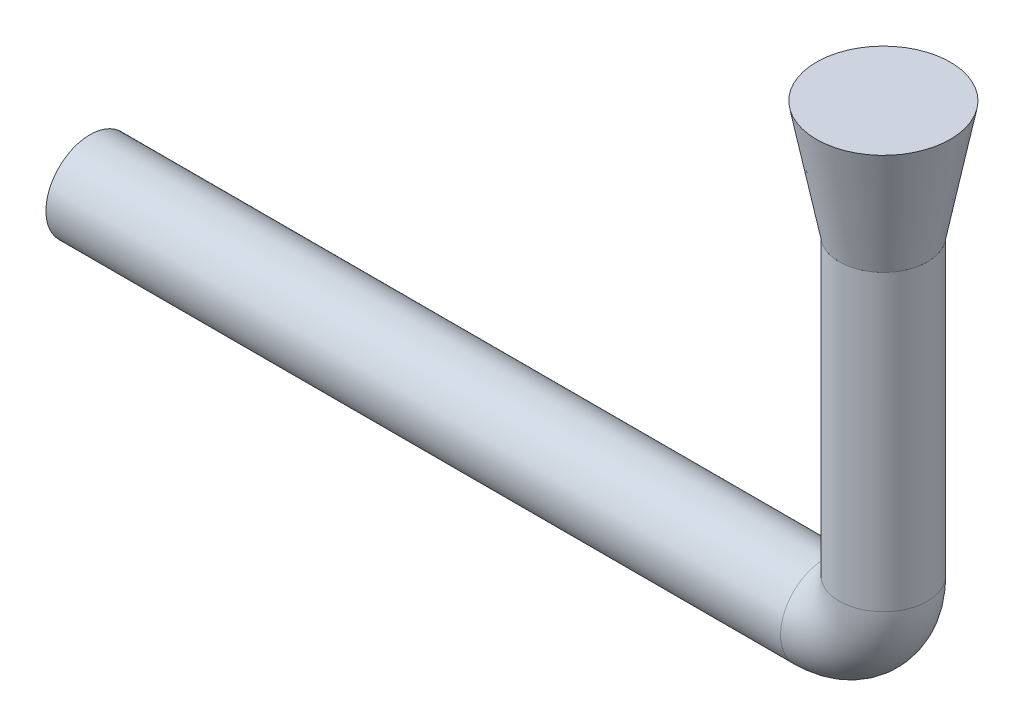
ISO-10303-21;
HEADER;
FILE_DESCRIPTION(('STEP AP214'),'2;1');
FILE_NAME('part.step','',(''),(''),'','','');
FILE_SCHEMA(('AUTOMOTIVE_DESIGN { 1 0 10303 214 1 1 1 1 }'));
ENDSEC;
DATA;
#1=APPLICATION_CONTEXT('core data for automotive mechanical design processes');
#2=APPLICATION_PROTOCOL_DEFINITION('international standard','automotive_design',2000,#1);
#3=PRODUCT_CONTEXT('',#1,'mechanical');
#4=PRODUCT('Part','Part','',(#3));
#5=PRODUCT_RELATED_PRODUCT_CATEGORY('part','',(#4));
#6=PRODUCT_DEFINITION_FORMATION('','',#4);
#7=PRODUCT_DEFINITION_CONTEXT('part definition',#1,'design');
#8=PRODUCT_DEFINITION('design','',#6,#7);
#9=PRODUCT_DEFINITION_SHAPE('','',#8);
#10=(LENGTH_UNIT() NAMED_UNIT(*) SI_UNIT(.MILLI.,.METRE.));
#11=(NAMED_UNIT(*) PLANE_ANGLE_UNIT() SI_UNIT($,.RADIAN.));
#12=(NAMED_UNIT(*) SI_UNIT($,.STERADIAN.) SOLID_ANGLE_UNIT());
#13=UNCERTAINTY_MEASURE_WITH_UNIT(LENGTH_MEASURE(1.E-05),#10,'distance_accuracy_value','');
#14=(GEOMETRIC_REPRESENTATION_CONTEXT(3) GLOBAL_UNCERTAINTY_ASSIGNED_CONTEXT((#13)) GLOBAL_UNIT_ASSIGNED_CONTEXT((#10,
#11,#12)) REPRESENTATION_CONTEXT('',''));
#15=CARTESIAN_POINT('',(0.,0.,0.));
#16=DIRECTION('',(0.,0.,1.));
#17=DIRECTION('',(1.,0.,0.));
#18=AXIS2_PLACEMENT_3D('',#15,#16,#17);
#19=CARTESIAN_POINT('',(270.,120.,0.));
#20=DIRECTION('',(0.,1.,0.));
#21=DIRECTION('',(0.,0.,1.));
#22=AXIS2_PLACEMENT_3D('',#19,#20,#21);
#23=CONICAL_SURFACE('',#22,15.,0.191986217719376);
#24=CARTESIAN_POINT('',(270.,160.,0.));
#25=DIRECTION('',(0.,1.,0.));
#26=DIRECTION('',(0.,0.,1.));
#27=AXIS2_PLACEMENT_3D('',#24,#25,#26);
#28=CIRCLE('',#27,22.7752123655088);
#29=CARTESIAN_POINT('',(270.,160.,22.7752123655088));
#30=VERTEX_POINT('',#29);
#31=EDGE_CURVE('E12',#30,#30,#28,.T.);
#32=ORIENTED_EDGE('',*,*,#31,.F.);
#33=EDGE_LOOP('',(#32));
#34=FACE_BOUND('',#33,.T.);
#35=CARTESIAN_POINT('',(270.,120.,0.));
#36=DIRECTION('',(0.,1.,0.));
#37=DIRECTION('',(0.,0.,1.));
#38=AXIS2_PLACEMENT_3D('',#35,#36,#37);
#39=CIRCLE('',#38,15.);
#40=CARTESIAN_POINT('',(270.,120.,15.));
#41=VERTEX_POINT('',#40);
#42=EDGE_CURVE('E60',#41,#41,#39,.T.);
#43=ORIENTED_EDGE('',*,*,#42,.T.);
#44=EDGE_LOOP('',(#43));
#45=FACE_BOUND('',#44,.T.);
#46=ADVANCED_FACE('F54',(#34,#45),#23,.T.);
#47=CARTESIAN_POINT('',(270.,160.,0.));
#48=DIRECTION('',(0.,1.,0.));
#49=DIRECTION('',(0.,0.,1.));
#50=AXIS2_PLACEMENT_3D('',#47,#48,#49);
#51=PLANE('',#50);
#52=ORIENTED_EDGE('',*,*,#31,.T.);
#53=EDGE_LOOP('',(#52));
#54=FACE_BOUND('',#53,.T.);
#55=ADVANCED_FACE('F69',(#54),#51,.T.);
#56=CARTESIAN_POINT('',(270.,120.,0.));
#57=DIRECTION('',(0.,1.,0.));
#58=DIRECTION('',(0.,0.,1.));
#59=AXIS2_PLACEMENT_3D('',#56,#57,#58);
#60=PLANE('',#59);
#61=ORIENTED_EDGE('',*,*,#42,.F.);
#62=EDGE_LOOP('',(#61));
#63=FACE_BOUND('',#62,.T.);
#64=ADVANCED_FACE('F67',(#63),#60,.F.);
#65=CLOSED_SHELL('',(#46,#55,#64));
#66=MANIFOLD_SOLID_BREP('B2',#65);
#67=CARTESIAN_POINT('',(0.,0.,0.));
#68=DIRECTION('',(-1.,0.,0.));
#69=DIRECTION('',(0.,0.,-1.));
#70=AXIS2_PLACEMENT_3D('',#67,#68,#69);
#71=PLANE('',#70);
#72=CARTESIAN_POINT('',(0.,0.,0.));
#73=DIRECTION('',(-1.,0.,0.));
#74=DIRECTION('',(0.,0.,-1.));
#75=AXIS2_PLACEMENT_3D('',#72,#73,#74);
#76=CIRCLE('',#75,15.);
#77=CARTESIAN_POINT('',(0.,0.,-15.));
#78=VERTEX_POINT('',#77);
#79=EDGE_CURVE('E106',#78,#78,#76,.T.);
#80=ORIENTED_EDGE('',*,*,#79,.T.);
#81=EDGE_LOOP('',(#80));
#82=FACE_BOUND('',#81,.T.);
#83=ADVANCED_FACE('F94',(#82),#71,.T.);
#84=CARTESIAN_POINT('',(270.,120.,0.));
#85=DIRECTION('',(0.,-1.,0.));
#86=DIRECTION('',(0.,0.,-1.));
#87=AXIS2_PLACEMENT_3D('',#84,#85,#86);
#88=PLANE('',#87);
#89=CARTESIAN_POINT('',(270.,120.,0.));
#90=DIRECTION('',(0.,-1.,0.));
#91=DIRECTION('',(0.,0.,-1.));
#92=AXIS2_PLACEMENT_3D('',#89,#90,#91);
#93=CIRCLE('',#92,15.);
#94=CARTESIAN_POINT('',(270.,120.,-15.));
#95=VERTEX_POINT('',#94);
#96=EDGE_CURVE('E52',#95,#95,#93,.T.);
#97=ORIENTED_EDGE('',*,*,#96,.F.);
#98=EDGE_LOOP('',(#97));
#99=FACE_BOUND('',#98,.T.);
#100=ADVANCED_FACE('F112',(#99),#88,.F.);
#101=CARTESIAN_POINT('',(0.,0.,0.));
#102=DIRECTION('',(1.,0.,0.));
#103=DIRECTION('',(0.,0.,-1.));
#104=AXIS2_PLACEMENT_3D('',#101,#102,#103);
#105=CYLINDRICAL_SURFACE('',#104,15.);
#106=CARTESIAN_POINT('',(250.,0.,0.));
#107=DIRECTION('',(-1.,0.,0.));
#108=DIRECTION('',(0.,0.,-1.));
#109=AXIS2_PLACEMENT_3D('',#106,#107,#108);
#110=CIRCLE('',#109,15.);
#111=CARTESIAN_POINT('',(250.,-15.,0.));
#112=VERTEX_POINT('',#111);
#113=EDGE_CURVE('E137',#112,#112,#110,.T.);
#114=ORIENTED_EDGE('',*,*,#113,.T.);
#115=EDGE_LOOP('',(#114));
#116=FACE_BOUND('',#115,.T.);
#117=ORIENTED_EDGE('',*,*,#79,.F.);
#118=EDGE_LOOP('',(#117));
#119=FACE_BOUND('',#118,.T.);
#120=ADVANCED_FACE('F114',(#116,#119),#105,.T.);
#121=CARTESIAN_POINT('',(250.,20.,0.));
#122=DIRECTION('',(0.,0.,1.));
#123=DIRECTION('',(1.,0.,0.));
#124=AXIS2_PLACEMENT_3D('',#121,#122,#123);
#125=TOROIDAL_SURFACE('',#124,20.,15.);
#126=CARTESIAN_POINT('',(270.,20.,0.));
#127=DIRECTION('',(0.,-1.,0.));
#128=DIRECTION('',(0.,0.,-1.));
#129=AXIS2_PLACEMENT_3D('',#126,#127,#128);
#130=CIRCLE('',#129,15.);
#131=CARTESIAN_POINT('',(285.,20.,0.));
#132=VERTEX_POINT('',#131);
#133=EDGE_CURVE('E101',#132,#132,#130,.T.);
#134=CARTESIAN_POINT('',(250.,20.,0.));
#135=DIRECTION('',(0.,0.,1.));
#136=DIRECTION('',(1.,0.,0.));
#137=AXIS2_PLACEMENT_3D('',#134,#135,#136);
#138=CIRCLE('',#137,35.);
#139=EDGE_CURVE('',#112,#132,#138,.T.);
#140=ORIENTED_EDGE('',*,*,#113,.F.);
#141=ORIENTED_EDGE('',*,*,#133,.T.);
#142=ORIENTED_EDGE('',*,*,#139,.T.);
#143=ORIENTED_EDGE('',*,*,#139,.F.);
#144=EDGE_LOOP('',(#140,#142,#141,#143));
#145=FACE_BOUND('',#144,.T.);
#146=ADVANCED_FACE('F119',(#145),#125,.T.);
#147=CARTESIAN_POINT('',(270.,20.,0.));
#148=DIRECTION('',(0.,1.,0.));
#149=DIRECTION('',(0.,0.,1.));
#150=AXIS2_PLACEMENT_3D('',#147,#148,#149);
#151=CYLINDRICAL_SURFACE('',#150,15.);
#152=ORIENTED_EDGE('',*,*,#96,.T.);
#153=EDGE_LOOP('',(#152));
#154=FACE_BOUND('',#153,.T.);
#155=ORIENTED_EDGE('',*,*,#133,.F.);
#156=EDGE_LOOP('',(#155));
#157=FACE_BOUND('',#156,.T.);
#158=ADVANCED_FACE('F109',(#154,#157),#151,.T.);
#159=CLOSED_SHELL('',(#83,#100,#120,#146,#158));
#160=MANIFOLD_SOLID_BREP('B7',#159);
#161=ADVANCED_BREP_SHAPE_REPRESENTATION('',(#18,#66,#160),#14);
#162=SHAPE_DEFINITION_REPRESENTATION(#9,#161);
ENDSEC;
END-ISO-10303-21;
